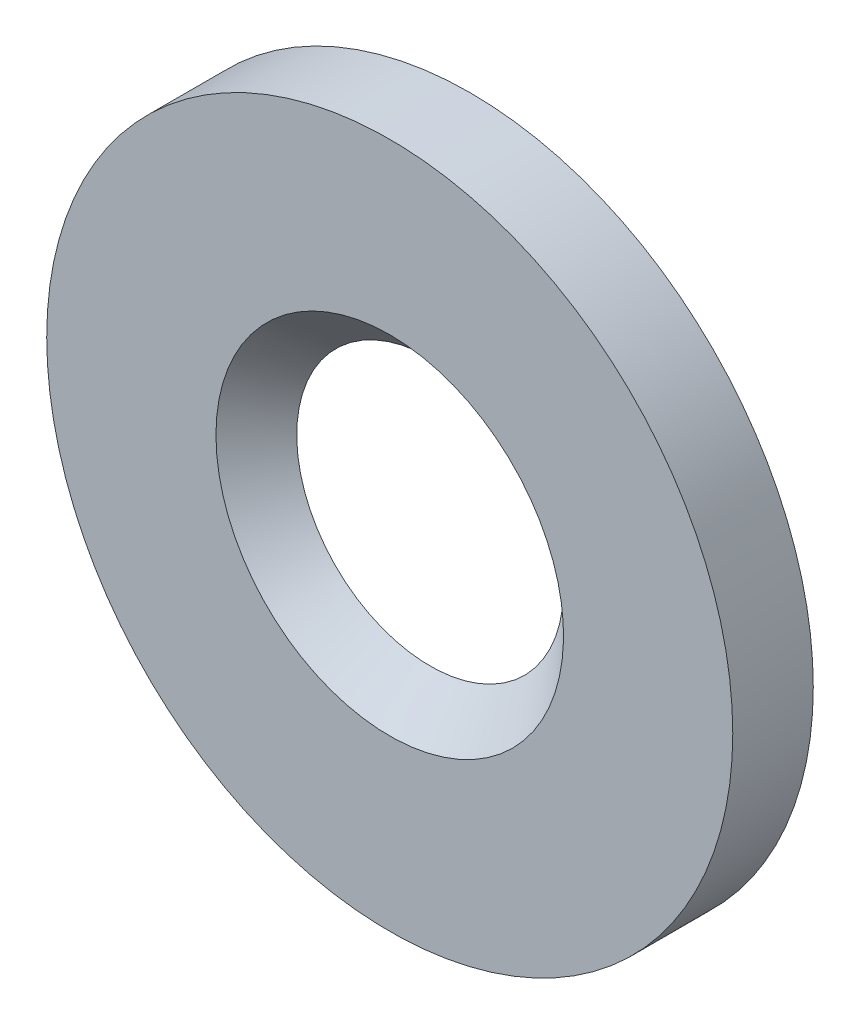
ISO-10303-21;
HEADER;
FILE_DESCRIPTION(('STEP AP214'),'2;1');
FILE_NAME('part.step','',(''),(''),'','','');
FILE_SCHEMA(('AUTOMOTIVE_DESIGN { 1 0 10303 214 1 1 1 1 }'));
ENDSEC;
DATA;
#1=APPLICATION_CONTEXT('core data for automotive mechanical design processes');
#2=APPLICATION_PROTOCOL_DEFINITION('international standard','automotive_design',2000,#1);
#3=PRODUCT_CONTEXT('',#1,'mechanical');
#4=PRODUCT('Part','Part','',(#3));
#5=PRODUCT_RELATED_PRODUCT_CATEGORY('part','',(#4));
#6=PRODUCT_DEFINITION_FORMATION('','',#4);
#7=PRODUCT_DEFINITION_CONTEXT('part definition',#1,'design');
#8=PRODUCT_DEFINITION('design','',#6,#7);
#9=PRODUCT_DEFINITION_SHAPE('','',#8);
#10=(LENGTH_UNIT() NAMED_UNIT(*) SI_UNIT(.MILLI.,.METRE.));
#11=(NAMED_UNIT(*) PLANE_ANGLE_UNIT() SI_UNIT($,.RADIAN.));
#12=(NAMED_UNIT(*) SI_UNIT($,.STERADIAN.) SOLID_ANGLE_UNIT());
#13=UNCERTAINTY_MEASURE_WITH_UNIT(LENGTH_MEASURE(1.E-05),#10,'distance_accuracy_value','');
#14=(GEOMETRIC_REPRESENTATION_CONTEXT(3) GLOBAL_UNCERTAINTY_ASSIGNED_CONTEXT((#13)) GLOBAL_UNIT_ASSIGNED_CONTEXT((#10,
#11,#12)) REPRESENTATION_CONTEXT('',''));
#15=CARTESIAN_POINT('',(0.,0.,0.));
#16=DIRECTION('',(0.,0.,1.));
#17=DIRECTION('',(1.,0.,0.));
#18=AXIS2_PLACEMENT_3D('',#15,#16,#17);
#19=CARTESIAN_POINT('',(0.,0.,20.1733));
#20=DIRECTION('',(0.,0.,1.));
#21=DIRECTION('',(1.,0.,0.));
#22=AXIS2_PLACEMENT_3D('',#19,#20,#21);
#23=PLANE('',#22);
#24=CARTESIAN_POINT('',(0.,0.,20.1733));
#25=DIRECTION('',(0.,0.,-1.));
#26=DIRECTION('',(-1.,0.,0.));
#27=AXIS2_PLACEMENT_3D('',#24,#25,#26);
#28=CIRCLE('',#27,6.83946674732544);
#29=CARTESIAN_POINT('',(-6.83946674732544,0.,20.1733));
#30=VERTEX_POINT('',#29);
#31=EDGE_CURVE('E46',#30,#30,#28,.T.);
#32=ORIENTED_EDGE('',*,*,#31,.T.);
#33=EDGE_LOOP('',(#32));
#34=FACE_BOUND('',#33,.T.);
#35=CARTESIAN_POINT('',(0.,0.,20.1733));
#36=DIRECTION('',(0.,0.,1.));
#37=DIRECTION('',(1.,0.,0.));
#38=AXIS2_PLACEMENT_3D('',#35,#36,#37);
#39=CIRCLE('',#38,13.5);
#40=CARTESIAN_POINT('',(13.5,0.,20.1733));
#41=VERTEX_POINT('',#40);
#42=EDGE_CURVE('E52',#41,#41,#39,.T.);
#43=ORIENTED_EDGE('',*,*,#42,.T.);
#44=EDGE_LOOP('',(#43));
#45=FACE_BOUND('',#44,.T.);
#46=ADVANCED_FACE('F39',(#34,#45),#23,.T.);
#47=CARTESIAN_POINT('',(0.,0.,-31.18));
#48=DIRECTION('',(0.,0.,1.));
#49=DIRECTION('',(0.,1.,0.));
#50=AXIS2_PLACEMENT_3D('',#47,#48,#49);
#51=SPHERICAL_SURFACE('',#50,50.04);
#52=CARTESIAN_POINT('',(0.,0.,18.5838332526746));
#53=DIRECTION('',(0.,0.,-1.));
#54=DIRECTION('',(-1.,0.,0.));
#55=AXIS2_PLACEMENT_3D('',#52,#53,#54);
#56=CIRCLE('',#55,5.25);
#57=CARTESIAN_POINT('',(0.,5.2499999999999,18.5838332526746));
#58=VERTEX_POINT('',#57);
#59=EDGE_CURVE('E10',#58,#58,#56,.T.);
#60=CARTESIAN_POINT('',(0.,0.,17.0045576922732));
#61=DIRECTION('',(0.,0.,-1.));
#62=DIRECTION('',(-1.,0.,0.));
#63=AXIS2_PLACEMENT_3D('',#60,#61,#62);
#64=CIRCLE('',#63,13.5);
#65=CARTESIAN_POINT('',(0.,13.4999999999999,17.0045576922732));
#66=VERTEX_POINT('',#65);
#67=EDGE_CURVE('E42',#66,#66,#64,.F.);
#68=CARTESIAN_POINT('',(0.,5.2499999999999,18.5838332526746));
#69=CARTESIAN_POINT('',(0.,5.33711749162763,18.5746425073655));
#70=CARTESIAN_POINT('',(0.,5.42421084852494,18.5652229933588));
#71=CARTESIAN_POINT('',(0.,5.59834689175852,18.5459266977055));
#72=CARTESIAN_POINT('',(0.,5.68538957809479,18.5360499160589));
#73=CARTESIAN_POINT('',(0.,5.85942187910603,18.5158393548813));
#74=CARTESIAN_POINT('',(0.,5.94641149378101,18.5055055753502));
#75=CARTESIAN_POINT('',(0.,6.12033525220775,18.4843813041433));
#76=CARTESIAN_POINT('',(0.,6.20726939595952,18.4735908124675));
#77=CARTESIAN_POINT('',(0.,6.38107981470755,18.4515534144021));
#78=CARTESIAN_POINT('',(0.,6.46795608970382,18.4403065080127));
#79=CARTESIAN_POINT('',(0.,6.6416483747316,18.4173565907827));
#80=CARTESIAN_POINT('',(0.,6.72846438476311,18.4056535799422));
#81=CARTESIAN_POINT('',(0.,6.90203374530712,18.3817917765881));
#82=CARTESIAN_POINT('',(0.,6.98878709581963,18.3696329840744));
#83=CARTESIAN_POINT('',(0.,7.1622287445016,18.3448599527405));
#84=CARTESIAN_POINT('',(0.,7.24891704267106,18.3322457139202));
#85=CARTESIAN_POINT('',(0.,7.42222619563665,18.3065621378971));
#86=CARTESIAN_POINT('',(0.,7.50884705043278,18.2934928006943));
#87=CARTESIAN_POINT('',(0.,7.68201892748177,18.2668993883838));
#88=CARTESIAN_POINT('',(0.,7.76856994973463,18.2533753132762));
#89=CARTESIAN_POINT('',(0.,7.94159977445324,18.225872798176));
#90=CARTESIAN_POINT('',(0.,8.02807857691898,18.2118943581835));
#91=CARTESIAN_POINT('',(0.,8.20096157681146,18.1834834988659));
#92=CARTESIAN_POINT('',(0.,8.28736577423819,18.1690510795408));
#93=CARTESIAN_POINT('',(0.,8.46009718085852,18.139732659632));
#94=CARTESIAN_POINT('',(0.,8.54642439005212,18.1248466590483));
#95=CARTESIAN_POINT('',(0.,8.71899943913551,18.0946214872068));
#96=CARTESIAN_POINT('',(0.,8.8052472790253,18.079282315949));
#97=CARTESIAN_POINT('',(0.,8.97766121061962,18.0481512258431));
#98=CARTESIAN_POINT('',(0.,9.06382730232413,18.0323593069951));
#99=CARTESIAN_POINT('',(0.,9.23607536092115,18.0003231572804));
#100=CARTESIAN_POINT('',(0.,9.32215732781365,17.9840789264137));
#101=CARTESIAN_POINT('',(0.,9.49423476248026,17.9511386007088));
#102=CARTESIAN_POINT('',(0.,9.58023023025437,17.9344425058706));
#103=CARTESIAN_POINT('',(0.,9.75213229476358,17.9005989127331));
#104=CARTESIAN_POINT('',(0.,9.83803889149869,17.8834514144338));
#105=CARTESIAN_POINT('',(0.,10.0097608444606,17.8487054873352));
#106=CARTESIAN_POINT('',(0.,10.0955762006873,17.8311070585358));
#107=CARTESIAN_POINT('',(0.,10.2671133056798,17.7954597558357));
#108=CARTESIAN_POINT('',(0.,10.3528350544455,17.7774108819348));
#109=CARTESIAN_POINT('',(0.,10.5241825801448,17.7408631868544));
#110=CARTESIAN_POINT('',(0.,10.6098083570785,17.7223643656747));
#111=CARTESIAN_POINT('',(0.,10.7809615773901,17.6849172862698));
#112=CARTESIAN_POINT('',(0.,10.866489020768,17.6659690280444));
#113=CARTESIAN_POINT('',(0.,11.0374432149564,17.6276235971775));
#114=CARTESIAN_POINT('',(0.,11.1228699657669,17.6082264245359));
#115=CARTESIAN_POINT('',(0.,11.2936204185864,17.5689836998479));
#116=CARTESIAN_POINT('',(0.,11.3789441205953,17.5491381478015));
#117=CARTESIAN_POINT('',(0.,11.5494861224195,17.5089992116821));
#118=CARTESIAN_POINT('',(0.,11.6347044222347,17.4887058276091));
#119=CARTESIAN_POINT('',(0.,11.8050332691869,17.4476717871682));
#120=CARTESIAN_POINT('',(0.,11.890143816324,17.4269311308003));
#121=CARTESIAN_POINT('',(0.,12.060254810406,17.3850031178331));
#122=CARTESIAN_POINT('',(0.,12.1452552573511,17.3638157612338));
#123=CARTESIAN_POINT('',(0.,12.3151437065769,17.3209949322054));
#124=CARTESIAN_POINT('',(0.,12.4000317088577,17.2993614597763));
#125=CARTESIAN_POINT('',(0.,12.5696929273667,17.2556489957312));
#126=CARTESIAN_POINT('',(0.,12.6544661435949,17.2335700041153));
#127=CARTESIAN_POINT('',(0.,12.8238954518414,17.1889671108633));
#128=CARTESIAN_POINT('',(0.,12.9085515438595,17.1664432092273));
#129=CARTESIAN_POINT('',(0.,13.0777442685176,17.1209511164949));
#130=CARTESIAN_POINT('',(0.,13.1622809011574,17.0979829253985));
#131=CARTESIAN_POINT('',(0.,13.3312323760856,17.0516028898382));
#132=CARTESIAN_POINT('',(0.,13.415647218374,17.0281910453744));
#133=CARTESIAN_POINT('',(0.,13.4999999999999,17.0045576922732));
#134=B_SPLINE_CURVE_WITH_KNOTS('',3,(#68,#69,#70,#71,#72,#73,#74,#75,#76,#77,#78,#79,#80,#81,
#82,#83,#84,#85,#86,#87,#88,#89,#90,#91,#92,#93,#94,#95,#96,#97,#98,#99,#100,#101,#102,#103,
#104,#105,#106,#107,#108,#109,#110,#111,#112,#113,#114,#115,#116,#117,#118,#119,#120,#121,#122,
#123,#124,#125,#126,#127,#128,#129,#130,#131,#132,#133),.UNSPECIFIED.,.F.,.F.,(4,2,2,2,2,2,2,2,
2,2,2,2,2,2,2,2,2,2,2,2,2,2,2,2,2,2,2,2,2,2,2,2,4),(0.,0.26280256002714,0.525605120054281,
0.788407680081412,1.05121024010855,1.31401280013569,1.57681536016283,1.83961792018998,
2.10242048021711,2.36522304024425,2.62802560027139,2.89082816029853,3.15363072032567,
3.41643328035281,3.67923584037994,3.94203840040708,4.20484096043422,4.46764352046137,
4.73044608048851,4.99324864051564,5.25605120054278,5.51885376056992,5.78165632059706,
6.0444588806242,6.30726144065134,6.57006400067847,6.83286656070562,7.09566912073276,
7.35847168075989,7.62127424078704,7.88407680081417,8.14687936084131,8.40968192086845),.UNSPECIFIED.);
#135=EDGE_CURVE('BSEAM61',#58,#66,#134,.T.);
#136=ORIENTED_EDGE('',*,*,#59,.F.);
#137=ORIENTED_EDGE('',*,*,#67,.F.);
#138=ORIENTED_EDGE('',*,*,#135,.T.);
#139=ORIENTED_EDGE('',*,*,#135,.F.);
#140=EDGE_LOOP('',(#136,#138,#137,#139));
#141=FACE_BOUND('',#140,.T.);
#142=ADVANCED_FACE('F61',(#141),#51,.F.);
#143=CARTESIAN_POINT('',(0.,0.,18.5838332526746));
#144=DIRECTION('',(0.,0.,1.));
#145=DIRECTION('',(1.,0.,0.));
#146=AXIS2_PLACEMENT_3D('',#143,#144,#145);
#147=CONICAL_SURFACE('',#146,5.25,0.785398163397453);
#148=ORIENTED_EDGE('',*,*,#31,.F.);
#149=EDGE_LOOP('',(#148));
#150=FACE_BOUND('',#149,.T.);
#151=ORIENTED_EDGE('',*,*,#59,.T.);
#152=EDGE_LOOP('',(#151));
#153=FACE_BOUND('',#152,.T.);
#154=ADVANCED_FACE('F63',(#150,#153),#147,.F.);
#155=CARTESIAN_POINT('',(0.,0.,16.5588898069488));
#156=DIRECTION('',(0.,0.,1.));
#157=DIRECTION('',(1.,0.,0.));
#158=AXIS2_PLACEMENT_3D('',#155,#156,#157);
#159=CYLINDRICAL_SURFACE('',#158,13.5);
#160=ORIENTED_EDGE('',*,*,#42,.F.);
#161=EDGE_LOOP('',(#160));
#162=FACE_BOUND('',#161,.T.);
#163=ORIENTED_EDGE('',*,*,#67,.T.);
#164=EDGE_LOOP('',(#163));
#165=FACE_BOUND('',#164,.T.);
#166=ADVANCED_FACE('F59',(#162,#165),#159,.T.);
#167=CLOSED_SHELL('',(#46,#142,#154,#166));
#168=MANIFOLD_SOLID_BREP('B2',#167);
#169=ADVANCED_BREP_SHAPE_REPRESENTATION('',(#18,#168),#14);
#170=SHAPE_DEFINITION_REPRESENTATION(#9,#169);
ENDSEC;
END-ISO-10303-21;
